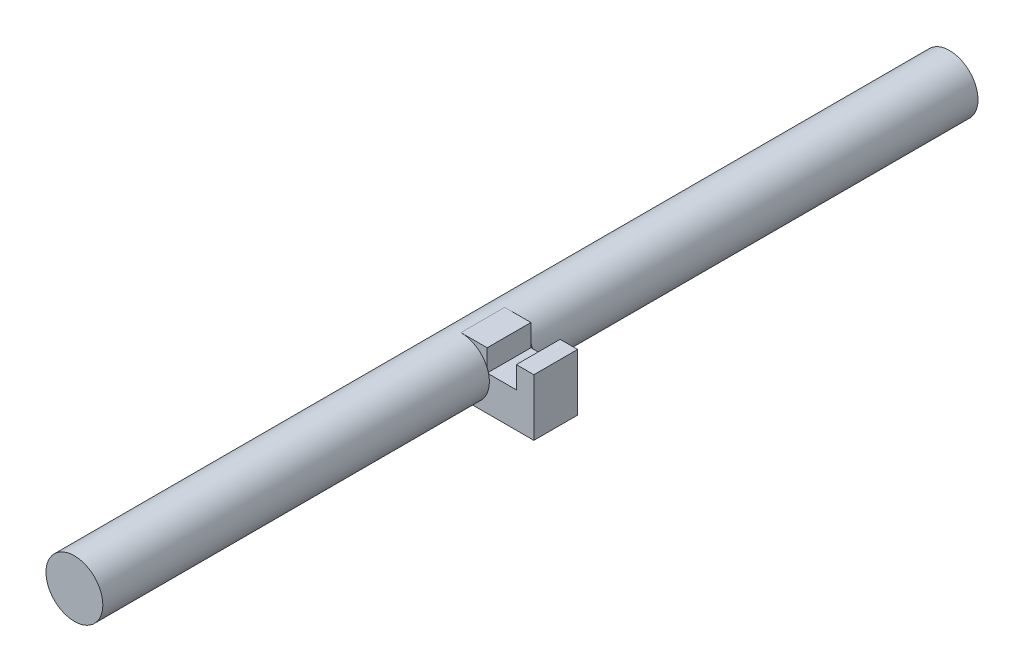
ISO-10303-21;
HEADER;
FILE_DESCRIPTION(('STEP AP214'),'2;1');
FILE_NAME('part.step','',(''),(''),'','','');
FILE_SCHEMA(('AUTOMOTIVE_DESIGN { 1 0 10303 214 1 1 1 1 }'));
ENDSEC;
DATA;
#1=APPLICATION_CONTEXT('core data for automotive mechanical design processes');
#2=APPLICATION_PROTOCOL_DEFINITION('international standard','automotive_design',2000,#1);
#3=PRODUCT_CONTEXT('',#1,'mechanical');
#4=PRODUCT('Part','Part','',(#3));
#5=PRODUCT_RELATED_PRODUCT_CATEGORY('part','',(#4));
#6=PRODUCT_DEFINITION_FORMATION('','',#4);
#7=PRODUCT_DEFINITION_CONTEXT('part definition',#1,'design');
#8=PRODUCT_DEFINITION('design','',#6,#7);
#9=PRODUCT_DEFINITION_SHAPE('','',#8);
#10=(LENGTH_UNIT() NAMED_UNIT(*) SI_UNIT(.MILLI.,.METRE.));
#11=(NAMED_UNIT(*) PLANE_ANGLE_UNIT() SI_UNIT($,.RADIAN.));
#12=(NAMED_UNIT(*) SI_UNIT($,.STERADIAN.) SOLID_ANGLE_UNIT());
#13=UNCERTAINTY_MEASURE_WITH_UNIT(LENGTH_MEASURE(1.E-05),#10,'distance_accuracy_value','');
#14=(GEOMETRIC_REPRESENTATION_CONTEXT(3) GLOBAL_UNCERTAINTY_ASSIGNED_CONTEXT((#13)) GLOBAL_UNIT_ASSIGNED_CONTEXT((#10,
#11,#12)) REPRESENTATION_CONTEXT('',''));
#15=CARTESIAN_POINT('',(0.,0.,0.));
#16=DIRECTION('',(0.,0.,1.));
#17=DIRECTION('',(1.,0.,0.));
#18=AXIS2_PLACEMENT_3D('',#15,#16,#17);
#19=CARTESIAN_POINT('',(5.,1.95,33.5));
#20=DIRECTION('',(0.,0.,-1.));
#21=DIRECTION('',(-1.,0.,0.));
#22=AXIS2_PLACEMENT_3D('',#19,#20,#21);
#23=PLANE('',#22);
#24=CARTESIAN_POINT('',(0.,0.,33.5));
#25=DIRECTION('',(0.,0.,-1.));
#26=DIRECTION('',(-1.,0.,0.));
#27=AXIS2_PLACEMENT_3D('',#24,#25,#26);
#28=CIRCLE('',#27,1.95);
#29=CARTESIAN_POINT('',(0.,1.95,33.5));
#30=VERTEX_POINT('',#29);
#31=CARTESIAN_POINT('',(1.8,0.749999999999998,33.5));
#32=VERTEX_POINT('',#31);
#33=EDGE_CURVE('E11',#30,#32,#28,.T.);
#34=ORIENTED_EDGE('',*,*,#33,.T.);
#35=DIRECTION('',(0.,1.,0.));
#36=VECTOR('',#35,1.);
#37=CARTESIAN_POINT('',(1.8,1.95,33.5));
#38=LINE('',#37,#36);
#39=CARTESIAN_POINT('',(1.8,1.95,33.5));
#40=VERTEX_POINT('',#39);
#41=EDGE_CURVE('E132',#32,#40,#38,.T.);
#42=ORIENTED_EDGE('',*,*,#41,.T.);
#43=DIRECTION('',(-1.,0.,0.));
#44=VECTOR('',#43,1.);
#45=CARTESIAN_POINT('',(5.,1.95,33.5));
#46=LINE('',#45,#44);
#47=EDGE_CURVE('E171',#40,#30,#46,.T.);
#48=ORIENTED_EDGE('',*,*,#47,.T.);
#49=EDGE_LOOP('',(#34,#42,#48));
#50=FACE_BOUND('',#49,.T.);
#51=ADVANCED_FACE('F35',(#50),#23,.F.);
#52=CARTESIAN_POINT('',(5.,1.95,30.5));
#53=DIRECTION('',(0.,0.,1.));
#54=DIRECTION('',(1.,0.,0.));
#55=AXIS2_PLACEMENT_3D('',#52,#53,#54);
#56=PLANE('',#55);
#57=DIRECTION('',(-1.,0.,0.));
#58=VECTOR('',#57,1.);
#59=CARTESIAN_POINT('',(5.,1.95,30.5));
#60=LINE('',#59,#58);
#61=CARTESIAN_POINT('',(1.8,1.95,30.5));
#62=VERTEX_POINT('',#61);
#63=CARTESIAN_POINT('',(0.,1.95,30.5));
#64=VERTEX_POINT('',#63);
#65=EDGE_CURVE('E177',#62,#64,#60,.T.);
#66=ORIENTED_EDGE('',*,*,#65,.F.);
#67=DIRECTION('',(0.,1.,0.));
#68=VECTOR('',#67,1.);
#69=CARTESIAN_POINT('',(1.8,1.95,30.5));
#70=LINE('',#69,#68);
#71=CARTESIAN_POINT('',(1.8,0.749999999999998,30.5));
#72=VERTEX_POINT('',#71);
#73=EDGE_CURVE('E50',#72,#62,#70,.T.);
#74=ORIENTED_EDGE('',*,*,#73,.F.);
#75=CARTESIAN_POINT('',(0.,0.,30.5));
#76=DIRECTION('',(0.,0.,1.));
#77=DIRECTION('',(1.,0.,0.));
#78=AXIS2_PLACEMENT_3D('',#75,#76,#77);
#79=CIRCLE('',#78,1.95);
#80=EDGE_CURVE('E191',#72,#64,#79,.T.);
#81=ORIENTED_EDGE('',*,*,#80,.T.);
#82=EDGE_LOOP('',(#66,#74,#81));
#83=FACE_BOUND('',#82,.T.);
#84=ADVANCED_FACE('F200',(#83),#56,.F.);
#85=CARTESIAN_POINT('',(5.,1.95,33.5));
#86=DIRECTION('',(0.,-1.,0.));
#87=DIRECTION('',(0.,0.,-1.));
#88=AXIS2_PLACEMENT_3D('',#85,#86,#87);
#89=PLANE('',#88);
#90=CARTESIAN_POINT('',(5.,1.95,30.5));
#91=VERTEX_POINT('',#90);
#92=CARTESIAN_POINT('',(3.8,1.95,30.5));
#93=VERTEX_POINT('',#92);
#94=EDGE_CURVE('E178',#91,#93,#60,.T.);
#95=ORIENTED_EDGE('',*,*,#94,.T.);
#96=DIRECTION('',(0.,0.,-1.));
#97=VECTOR('',#96,1.);
#98=CARTESIAN_POINT('',(3.8,1.95,33.5));
#99=LINE('',#98,#97);
#100=CARTESIAN_POINT('',(3.8,1.95,33.5));
#101=VERTEX_POINT('',#100);
#102=EDGE_CURVE('E149',#101,#93,#99,.T.);
#103=ORIENTED_EDGE('',*,*,#102,.F.);
#104=CARTESIAN_POINT('',(5.,1.95,33.5));
#105=VERTEX_POINT('',#104);
#106=EDGE_CURVE('E138',#105,#101,#46,.T.);
#107=ORIENTED_EDGE('',*,*,#106,.F.);
#108=DIRECTION('',(0.,0.,1.));
#109=VECTOR('',#108,1.);
#110=CARTESIAN_POINT('',(5.,1.95,33.5));
#111=LINE('',#110,#109);
#112=EDGE_CURVE('E169',#91,#105,#111,.T.);
#113=ORIENTED_EDGE('',*,*,#112,.F.);
#114=EDGE_LOOP('',(#95,#103,#107,#113));
#115=FACE_BOUND('',#114,.T.);
#116=ADVANCED_FACE('F227',(#115),#89,.F.);
#117=CARTESIAN_POINT('',(0.,0.,60.));
#118=DIRECTION('',(0.,0.,-1.));
#119=DIRECTION('',(-1.,0.,0.));
#120=AXIS2_PLACEMENT_3D('',#117,#118,#119);
#121=CYLINDRICAL_SURFACE('',#120,1.95);
#122=CARTESIAN_POINT('',(0.,0.,0.));
#123=DIRECTION('',(0.,0.,1.));
#124=DIRECTION('',(1.,0.,0.));
#125=AXIS2_PLACEMENT_3D('',#122,#123,#124);
#126=CIRCLE('',#125,1.95);
#127=CARTESIAN_POINT('',(1.95,0.,0.));
#128=VERTEX_POINT('',#127);
#129=EDGE_CURVE('E187',#128,#128,#126,.T.);
#130=ORIENTED_EDGE('',*,*,#129,.T.);
#131=EDGE_LOOP('',(#130));
#132=FACE_BOUND('',#131,.T.);
#133=CARTESIAN_POINT('',(0.,0.,60.));
#134=DIRECTION('',(0.,0.,1.));
#135=DIRECTION('',(1.,0.,0.));
#136=AXIS2_PLACEMENT_3D('',#133,#134,#135);
#137=CIRCLE('',#136,1.95);
#138=CARTESIAN_POINT('',(1.95,0.,60.));
#139=VERTEX_POINT('',#138);
#140=EDGE_CURVE('E188',#139,#139,#137,.T.);
#141=ORIENTED_EDGE('',*,*,#140,.F.);
#142=EDGE_LOOP('',(#141));
#143=FACE_BOUND('',#142,.T.);
#144=ORIENTED_EDGE('',*,*,#33,.F.);
#145=DIRECTION('',(0.,0.,1.));
#146=VECTOR('',#145,1.);
#147=CARTESIAN_POINT('',(0.,1.95,33.5));
#148=LINE('',#147,#146);
#149=EDGE_CURVE('E165',#64,#30,#148,.T.);
#150=ORIENTED_EDGE('',*,*,#149,.F.);
#151=ORIENTED_EDGE('',*,*,#80,.F.);
#152=CARTESIAN_POINT('',(0.,0.,30.5));
#153=DIRECTION('',(0.,0.,-1.));
#154=DIRECTION('',(-1.,0.,0.));
#155=AXIS2_PLACEMENT_3D('',#152,#153,#154);
#156=CIRCLE('',#155,1.95);
#157=CARTESIAN_POINT('',(1.89736659610103,0.45,30.5));
#158=VERTEX_POINT('',#157);
#159=EDGE_CURVE('E151',#72,#158,#156,.T.);
#160=ORIENTED_EDGE('',*,*,#159,.T.);
#161=CARTESIAN_POINT('',(0.,-1.95,30.5));
#162=VERTEX_POINT('',#161);
#163=EDGE_CURVE('E193',#162,#158,#79,.T.);
#164=ORIENTED_EDGE('',*,*,#163,.F.);
#165=DIRECTION('',(0.,0.,-1.));
#166=VECTOR('',#165,1.);
#167=CARTESIAN_POINT('',(0.,-1.95,33.5));
#168=LINE('',#167,#166);
#169=CARTESIAN_POINT('',(0.,-1.95,33.5));
#170=VERTEX_POINT('',#169);
#171=EDGE_CURVE('E160',#170,#162,#168,.T.);
#172=ORIENTED_EDGE('',*,*,#171,.F.);
#173=CARTESIAN_POINT('',(1.89736659610103,0.45,33.5));
#174=VERTEX_POINT('',#173);
#175=EDGE_CURVE('E43',#174,#170,#28,.T.);
#176=ORIENTED_EDGE('',*,*,#175,.F.);
#177=CARTESIAN_POINT('',(0.,0.,33.5));
#178=DIRECTION('',(0.,0.,-1.));
#179=DIRECTION('',(-1.,0.,0.));
#180=AXIS2_PLACEMENT_3D('',#177,#178,#179);
#181=CIRCLE('',#180,1.95);
#182=EDGE_CURVE('E158',#32,#174,#181,.T.);
#183=ORIENTED_EDGE('',*,*,#182,.F.);
#184=EDGE_LOOP('',(#144,#150,#151,#160,#164,#172,#176,#183));
#185=FACE_BOUND('',#184,.T.);
#186=ADVANCED_FACE('F37',(#132,#143,#185),#121,.T.);
#187=CARTESIAN_POINT('',(0.,0.,60.));
#188=DIRECTION('',(0.,0.,1.));
#189=DIRECTION('',(1.,0.,0.));
#190=AXIS2_PLACEMENT_3D('',#187,#188,#189);
#191=PLANE('',#190);
#192=ORIENTED_EDGE('',*,*,#140,.T.);
#193=EDGE_LOOP('',(#192));
#194=FACE_BOUND('',#193,.T.);
#195=ADVANCED_FACE('F234',(#194),#191,.T.);
#196=CARTESIAN_POINT('',(0.,0.,0.));
#197=DIRECTION('',(0.,0.,1.));
#198=DIRECTION('',(1.,0.,0.));
#199=AXIS2_PLACEMENT_3D('',#196,#197,#198);
#200=PLANE('',#199);
#201=ORIENTED_EDGE('',*,*,#129,.F.);
#202=EDGE_LOOP('',(#201));
#203=FACE_BOUND('',#202,.T.);
#204=ADVANCED_FACE('F246',(#203),#200,.F.);
#205=ORIENTED_EDGE('',*,*,#106,.T.);
#206=DIRECTION('',(0.,-1.,0.));
#207=VECTOR('',#206,1.);
#208=CARTESIAN_POINT('',(3.8,1.95,33.5));
#209=LINE('',#208,#207);
#210=CARTESIAN_POINT('',(3.8,0.45,33.5));
#211=VERTEX_POINT('',#210);
#212=EDGE_CURVE('E117',#101,#211,#209,.T.);
#213=ORIENTED_EDGE('',*,*,#212,.T.);
#214=DIRECTION('',(-1.,0.,0.));
#215=VECTOR('',#214,1.);
#216=CARTESIAN_POINT('',(3.8,0.45,33.5));
#217=LINE('',#216,#215);
#218=EDGE_CURVE('E128',#211,#174,#217,.T.);
#219=ORIENTED_EDGE('',*,*,#218,.T.);
#220=ORIENTED_EDGE('',*,*,#175,.T.);
#221=DIRECTION('',(-1.,0.,0.));
#222=VECTOR('',#221,1.);
#223=CARTESIAN_POINT('',(5.,-1.95,33.5));
#224=LINE('',#223,#222);
#225=CARTESIAN_POINT('',(5.,-1.95,33.5));
#226=VERTEX_POINT('',#225);
#227=EDGE_CURVE('E184',#226,#170,#224,.T.);
#228=ORIENTED_EDGE('',*,*,#227,.F.);
#229=DIRECTION('',(0.,-1.,0.));
#230=VECTOR('',#229,1.);
#231=CARTESIAN_POINT('',(5.,1.95,33.5));
#232=LINE('',#231,#230);
#233=EDGE_CURVE('E161',#105,#226,#232,.T.);
#234=ORIENTED_EDGE('',*,*,#233,.F.);
#235=EDGE_LOOP('',(#205,#213,#219,#220,#228,#234));
#236=FACE_BOUND('',#235,.T.);
#237=ADVANCED_FACE('F135',(#236),#23,.F.);
#238=CARTESIAN_POINT('',(5.,-1.95,33.5));
#239=DIRECTION('',(0.,1.,0.));
#240=DIRECTION('',(0.,0.,1.));
#241=AXIS2_PLACEMENT_3D('',#238,#239,#240);
#242=PLANE('',#241);
#243=ORIENTED_EDGE('',*,*,#171,.T.);
#244=DIRECTION('',(-1.,0.,0.));
#245=VECTOR('',#244,1.);
#246=CARTESIAN_POINT('',(5.,-1.95,30.5));
#247=LINE('',#246,#245);
#248=CARTESIAN_POINT('',(5.,-1.95,30.5));
#249=VERTEX_POINT('',#248);
#250=EDGE_CURVE('E181',#249,#162,#247,.T.);
#251=ORIENTED_EDGE('',*,*,#250,.F.);
#252=DIRECTION('',(0.,0.,-1.));
#253=VECTOR('',#252,1.);
#254=CARTESIAN_POINT('',(5.,-1.95,33.5));
#255=LINE('',#254,#253);
#256=EDGE_CURVE('E164',#226,#249,#255,.T.);
#257=ORIENTED_EDGE('',*,*,#256,.F.);
#258=ORIENTED_EDGE('',*,*,#227,.T.);
#259=EDGE_LOOP('',(#243,#251,#257,#258));
#260=FACE_BOUND('',#259,.T.);
#261=ADVANCED_FACE('F219',(#260),#242,.F.);
#262=DIRECTION('',(-1.,0.,0.));
#263=VECTOR('',#262,1.);
#264=CARTESIAN_POINT('',(3.8,0.45,30.5));
#265=LINE('',#264,#263);
#266=CARTESIAN_POINT('',(3.8,0.45,30.5));
#267=VERTEX_POINT('',#266);
#268=EDGE_CURVE('E147',#267,#158,#265,.T.);
#269=ORIENTED_EDGE('',*,*,#268,.F.);
#270=DIRECTION('',(0.,-1.,0.));
#271=VECTOR('',#270,1.);
#272=CARTESIAN_POINT('',(3.8,1.95,30.5));
#273=LINE('',#272,#271);
#274=EDGE_CURVE('E120',#93,#267,#273,.T.);
#275=ORIENTED_EDGE('',*,*,#274,.F.);
#276=ORIENTED_EDGE('',*,*,#94,.F.);
#277=DIRECTION('',(0.,1.,0.));
#278=VECTOR('',#277,1.);
#279=CARTESIAN_POINT('',(5.,1.95,30.5));
#280=LINE('',#279,#278);
#281=EDGE_CURVE('E167',#249,#91,#280,.T.);
#282=ORIENTED_EDGE('',*,*,#281,.F.);
#283=ORIENTED_EDGE('',*,*,#250,.T.);
#284=ORIENTED_EDGE('',*,*,#163,.T.);
#285=EDGE_LOOP('',(#269,#275,#276,#282,#283,#284));
#286=FACE_BOUND('',#285,.T.);
#287=ADVANCED_FACE('F221',(#286),#56,.F.);
#288=ORIENTED_EDGE('',*,*,#47,.F.);
#289=DIRECTION('',(0.,0.,-1.));
#290=VECTOR('',#289,1.);
#291=CARTESIAN_POINT('',(1.8,1.95,33.5));
#292=LINE('',#291,#290);
#293=EDGE_CURVE('E152',#40,#62,#292,.T.);
#294=ORIENTED_EDGE('',*,*,#293,.T.);
#295=ORIENTED_EDGE('',*,*,#65,.T.);
#296=ORIENTED_EDGE('',*,*,#149,.T.);
#297=EDGE_LOOP('',(#288,#294,#295,#296));
#298=FACE_BOUND('',#297,.T.);
#299=ADVANCED_FACE('F205',(#298),#89,.F.);
#300=CARTESIAN_POINT('',(5.,0.,0.));
#301=DIRECTION('',(1.,0.,0.));
#302=DIRECTION('',(0.,0.,-1.));
#303=AXIS2_PLACEMENT_3D('',#300,#301,#302);
#304=PLANE('',#303);
#305=ORIENTED_EDGE('',*,*,#233,.T.);
#306=ORIENTED_EDGE('',*,*,#256,.T.);
#307=ORIENTED_EDGE('',*,*,#281,.T.);
#308=ORIENTED_EDGE('',*,*,#112,.T.);
#309=EDGE_LOOP('',(#305,#306,#307,#308));
#310=FACE_BOUND('',#309,.T.);
#311=ADVANCED_FACE('F225',(#310),#304,.T.);
#312=CARTESIAN_POINT('',(0.,0.,33.5));
#313=DIRECTION('',(0.,0.,-1.));
#314=DIRECTION('',(-1.,0.,0.));
#315=AXIS2_PLACEMENT_3D('',#312,#313,#314);
#316=PLANE('',#315);
#317=ORIENTED_EDGE('',*,*,#182,.T.);
#318=CARTESIAN_POINT('',(1.8,0.45,33.5));
#319=VERTEX_POINT('',#318);
#320=EDGE_CURVE('E131',#174,#319,#217,.T.);
#321=ORIENTED_EDGE('',*,*,#320,.T.);
#322=EDGE_CURVE('E125',#319,#32,#38,.T.);
#323=ORIENTED_EDGE('',*,*,#322,.T.);
#324=EDGE_LOOP('',(#317,#321,#323));
#325=FACE_BOUND('',#324,.T.);
#326=ADVANCED_FACE('F213',(#325),#316,.T.);
#327=CARTESIAN_POINT('',(0.,0.,30.5));
#328=DIRECTION('',(0.,0.,-1.));
#329=DIRECTION('',(-1.,0.,0.));
#330=AXIS2_PLACEMENT_3D('',#327,#328,#329);
#331=PLANE('',#330);
#332=CARTESIAN_POINT('',(1.8,0.45,30.5));
#333=VERTEX_POINT('',#332);
#334=EDGE_CURVE('E139',#333,#72,#70,.T.);
#335=ORIENTED_EDGE('',*,*,#334,.F.);
#336=EDGE_CURVE('E146',#158,#333,#265,.T.);
#337=ORIENTED_EDGE('',*,*,#336,.F.);
#338=ORIENTED_EDGE('',*,*,#159,.F.);
#339=EDGE_LOOP('',(#335,#337,#338));
#340=FACE_BOUND('',#339,.T.);
#341=ADVANCED_FACE('F216',(#340),#331,.F.);
#342=CARTESIAN_POINT('',(3.8,1.95,33.5));
#343=DIRECTION('',(1.,0.,0.));
#344=DIRECTION('',(0.,1.,0.));
#345=AXIS2_PLACEMENT_3D('',#342,#343,#344);
#346=PLANE('',#345);
#347=ORIENTED_EDGE('',*,*,#274,.T.);
#348=DIRECTION('',(0.,0.,-1.));
#349=VECTOR('',#348,1.);
#350=CARTESIAN_POINT('',(3.8,0.45,33.5));
#351=LINE('',#350,#349);
#352=EDGE_CURVE('E113',#211,#267,#351,.T.);
#353=ORIENTED_EDGE('',*,*,#352,.F.);
#354=ORIENTED_EDGE('',*,*,#212,.F.);
#355=ORIENTED_EDGE('',*,*,#102,.T.);
#356=EDGE_LOOP('',(#347,#353,#354,#355));
#357=FACE_BOUND('',#356,.T.);
#358=ADVANCED_FACE('F115',(#357),#346,.F.);
#359=CARTESIAN_POINT('',(1.8,1.95,33.5));
#360=DIRECTION('',(-1.,0.,0.));
#361=DIRECTION('',(0.,-1.,0.));
#362=AXIS2_PLACEMENT_3D('',#359,#360,#361);
#363=PLANE('',#362);
#364=ORIENTED_EDGE('',*,*,#334,.T.);
#365=ORIENTED_EDGE('',*,*,#73,.T.);
#366=ORIENTED_EDGE('',*,*,#293,.F.);
#367=ORIENTED_EDGE('',*,*,#41,.F.);
#368=ORIENTED_EDGE('',*,*,#322,.F.);
#369=DIRECTION('',(0.,0.,-1.));
#370=VECTOR('',#369,1.);
#371=CARTESIAN_POINT('',(1.8,0.45,33.5));
#372=LINE('',#371,#370);
#373=EDGE_CURVE('E124',#319,#333,#372,.T.);
#374=ORIENTED_EDGE('',*,*,#373,.T.);
#375=EDGE_LOOP('',(#364,#365,#366,#367,#368,#374));
#376=FACE_BOUND('',#375,.T.);
#377=ADVANCED_FACE('F211',(#376),#363,.F.);
#378=CARTESIAN_POINT('',(3.8,0.45,33.5));
#379=DIRECTION('',(0.,-1.,0.));
#380=DIRECTION('',(0.,0.,-1.));
#381=AXIS2_PLACEMENT_3D('',#378,#379,#380);
#382=PLANE('',#381);
#383=ORIENTED_EDGE('',*,*,#268,.T.);
#384=ORIENTED_EDGE('',*,*,#336,.T.);
#385=ORIENTED_EDGE('',*,*,#373,.F.);
#386=ORIENTED_EDGE('',*,*,#320,.F.);
#387=ORIENTED_EDGE('',*,*,#218,.F.);
#388=ORIENTED_EDGE('',*,*,#352,.T.);
#389=EDGE_LOOP('',(#383,#384,#385,#386,#387,#388));
#390=FACE_BOUND('',#389,.T.);
#391=ADVANCED_FACE('F129',(#390),#382,.F.);
#392=CLOSED_SHELL('',(#51,#84,#116,#186,#195,#204,#237,#261,#287,#299,#311,#326,#341,#358,#377,#391));
#393=MANIFOLD_SOLID_BREP('B2',#392);
#394=ADVANCED_BREP_SHAPE_REPRESENTATION('',(#18,#393),#14);
#395=SHAPE_DEFINITION_REPRESENTATION(#9,#394);
ENDSEC;
END-ISO-10303-21;
